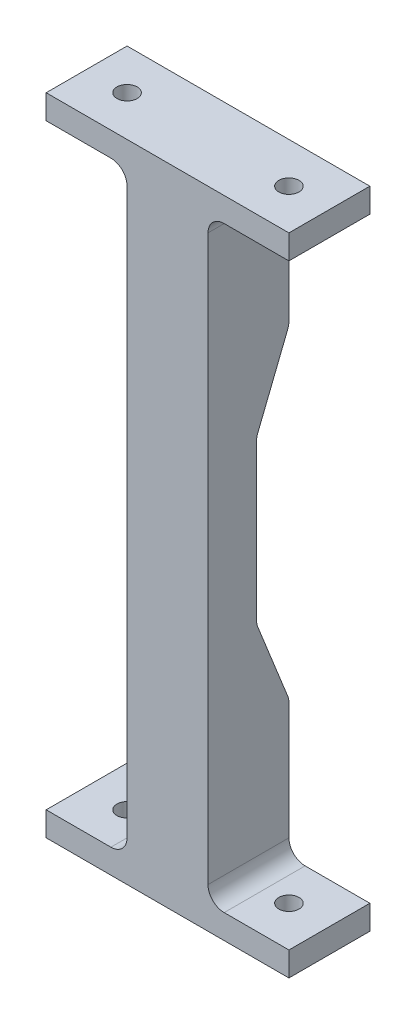
ISO-10303-21;
HEADER;
FILE_DESCRIPTION(('STEP AP214'),'2;1');
FILE_NAME('part.step','',(''),(''),'','','');
FILE_SCHEMA(('AUTOMOTIVE_DESIGN { 1 0 10303 214 1 1 1 1 }'));
ENDSEC;
DATA;
#1=APPLICATION_CONTEXT('core data for automotive mechanical design processes');
#2=APPLICATION_PROTOCOL_DEFINITION('international standard','automotive_design',2000,#1);
#3=PRODUCT_CONTEXT('',#1,'mechanical');
#4=PRODUCT('Part','Part','',(#3));
#5=PRODUCT_RELATED_PRODUCT_CATEGORY('part','',(#4));
#6=PRODUCT_DEFINITION_FORMATION('','',#4);
#7=PRODUCT_DEFINITION_CONTEXT('part definition',#1,'design');
#8=PRODUCT_DEFINITION('design','',#6,#7);
#9=PRODUCT_DEFINITION_SHAPE('','',#8);
#10=(LENGTH_UNIT() NAMED_UNIT(*) SI_UNIT(.MILLI.,.METRE.));
#11=(NAMED_UNIT(*) PLANE_ANGLE_UNIT() SI_UNIT($,.RADIAN.));
#12=(NAMED_UNIT(*) SI_UNIT($,.STERADIAN.) SOLID_ANGLE_UNIT());
#13=UNCERTAINTY_MEASURE_WITH_UNIT(LENGTH_MEASURE(1.E-05),#10,'distance_accuracy_value','');
#14=(GEOMETRIC_REPRESENTATION_CONTEXT(3) GLOBAL_UNCERTAINTY_ASSIGNED_CONTEXT((#13)) GLOBAL_UNIT_ASSIGNED_CONTEXT((#10,
#11,#12)) REPRESENTATION_CONTEXT('',''));
#15=CARTESIAN_POINT('',(0.,0.,0.));
#16=DIRECTION('',(0.,0.,1.));
#17=DIRECTION('',(1.,0.,0.));
#18=AXIS2_PLACEMENT_3D('',#15,#16,#17);
#19=CARTESIAN_POINT('',(0.,0.,-6.35));
#20=DIRECTION('',(0.,0.,-1.));
#21=DIRECTION('',(-1.,0.,0.));
#22=AXIS2_PLACEMENT_3D('',#19,#20,#21);
#23=PLANE('',#22);
#24=DIRECTION('',(0.,1.,0.));
#25=VECTOR('',#24,1.);
#26=CARTESIAN_POINT('',(6.35000000000001,3.81,-6.35));
#27=LINE('',#26,#25);
#28=CARTESIAN_POINT('',(6.34999999999999,76.5240593050608,-6.35));
#29=VERTEX_POINT('',#28);
#30=CARTESIAN_POINT('',(6.34999999999999,94.9198,-6.35));
#31=VERTEX_POINT('',#30);
#32=EDGE_CURVE('E459',#29,#31,#27,.T.);
#33=ORIENTED_EDGE('',*,*,#32,.F.);
#34=DIRECTION('',(1.,0.,0.));
#35=VECTOR('',#34,1.);
#36=CARTESIAN_POINT('',(-6.34999999999999,76.5240593050608,-6.35));
#37=LINE('',#36,#35);
#38=CARTESIAN_POINT('',(-6.34999999999999,76.5240593050608,-6.35));
#39=VERTEX_POINT('',#38);
#40=EDGE_CURVE('E316',#29,#39,#37,.F.);
#41=ORIENTED_EDGE('',*,*,#40,.T.);
#42=DIRECTION('',(0.,-1.,0.));
#43=VECTOR('',#42,1.);
#44=CARTESIAN_POINT('',(-6.34999999999999,3.81,-6.35));
#45=LINE('',#44,#43);
#46=CARTESIAN_POINT('',(-6.34999999999999,94.9198,-6.35));
#47=VERTEX_POINT('',#46);
#48=EDGE_CURVE('E481',#47,#39,#45,.T.);
#49=ORIENTED_EDGE('',*,*,#48,.F.);
#50=CARTESIAN_POINT('',(-8.88999999999999,94.9198,-6.35));
#51=DIRECTION('',(0.,0.,-1.));
#52=DIRECTION('',(-1.,0.,0.));
#53=AXIS2_PLACEMENT_3D('',#50,#51,#52);
#54=CIRCLE('',#53,2.54);
#55=CARTESIAN_POINT('',(-8.88999999999999,97.4598,-6.35));
#56=VERTEX_POINT('',#55);
#57=EDGE_CURVE('E289',#47,#56,#54,.F.);
#58=ORIENTED_EDGE('',*,*,#57,.T.);
#59=DIRECTION('',(1.,0.,0.));
#60=VECTOR('',#59,1.);
#61=CARTESIAN_POINT('',(-6.34999999999999,97.4598,-6.35));
#62=LINE('',#61,#60);
#63=CARTESIAN_POINT('',(-19.05,97.4598,-6.35));
#64=VERTEX_POINT('',#63);
#65=EDGE_CURVE('E476',#64,#56,#62,.T.);
#66=ORIENTED_EDGE('',*,*,#65,.F.);
#67=DIRECTION('',(0.,-1.,0.));
#68=VECTOR('',#67,1.);
#69=CARTESIAN_POINT('',(-19.05,97.4598,-6.35));
#70=LINE('',#69,#68);
#71=CARTESIAN_POINT('',(-19.05,101.2698,-6.35));
#72=VERTEX_POINT('',#71);
#73=EDGE_CURVE('E473',#72,#64,#70,.T.);
#74=ORIENTED_EDGE('',*,*,#73,.F.);
#75=DIRECTION('',(-1.,0.,0.));
#76=VECTOR('',#75,1.);
#77=CARTESIAN_POINT('',(-19.05,101.2698,-6.35));
#78=LINE('',#77,#76);
#79=CARTESIAN_POINT('',(19.05,101.2698,-6.35));
#80=VERTEX_POINT('',#79);
#81=EDGE_CURVE('E470',#80,#72,#78,.T.);
#82=ORIENTED_EDGE('',*,*,#81,.F.);
#83=DIRECTION('',(0.,1.,0.));
#84=VECTOR('',#83,1.);
#85=CARTESIAN_POINT('',(19.05,97.4598,-6.35));
#86=LINE('',#85,#84);
#87=CARTESIAN_POINT('',(19.05,97.4598,-6.35));
#88=VERTEX_POINT('',#87);
#89=EDGE_CURVE('E467',#88,#80,#86,.T.);
#90=ORIENTED_EDGE('',*,*,#89,.F.);
#91=DIRECTION('',(1.,0.,0.));
#92=VECTOR('',#91,1.);
#93=CARTESIAN_POINT('',(6.34999999999999,97.4598,-6.35));
#94=LINE('',#93,#92);
#95=CARTESIAN_POINT('',(8.88999999999999,97.4598,-6.35));
#96=VERTEX_POINT('',#95);
#97=EDGE_CURVE('E464',#96,#88,#94,.T.);
#98=ORIENTED_EDGE('',*,*,#97,.F.);
#99=CARTESIAN_POINT('',(8.88999999999999,94.9198,-6.35));
#100=DIRECTION('',(0.,0.,-1.));
#101=DIRECTION('',(-1.,0.,0.));
#102=AXIS2_PLACEMENT_3D('',#99,#100,#101);
#103=CIRCLE('',#102,2.54);
#104=EDGE_CURVE('E295',#96,#31,#103,.F.);
#105=ORIENTED_EDGE('',*,*,#104,.T.);
#106=EDGE_LOOP('',(#33,#41,#49,#58,#66,#74,#82,#90,#98,#105));
#107=FACE_BOUND('',#106,.T.);
#108=ADVANCED_FACE('F49',(#107),#23,.T.);
#109=CARTESIAN_POINT('',(-19.05,0.,6.35));
#110=DIRECTION('',(1.,0.,0.));
#111=DIRECTION('',(0.,0.,-1.));
#112=AXIS2_PLACEMENT_3D('',#109,#110,#111);
#113=PLANE('',#112);
#114=DIRECTION('',(0.,-1.,0.));
#115=VECTOR('',#114,1.);
#116=CARTESIAN_POINT('',(-19.05,0.,-6.35));
#117=LINE('',#116,#115);
#118=CARTESIAN_POINT('',(-19.05,3.81,-6.35));
#119=VERTEX_POINT('',#118);
#120=CARTESIAN_POINT('',(-19.05,0.,-6.35));
#121=VERTEX_POINT('',#120);
#122=EDGE_CURVE('E234',#119,#121,#117,.T.);
#123=ORIENTED_EDGE('',*,*,#122,.T.);
#124=DIRECTION('',(0.,0.,-1.));
#125=VECTOR('',#124,1.);
#126=CARTESIAN_POINT('',(-19.05,0.,6.35));
#127=LINE('',#126,#125);
#128=CARTESIAN_POINT('',(-19.05,0.,6.35));
#129=VERTEX_POINT('',#128);
#130=EDGE_CURVE('E212',#129,#121,#127,.T.);
#131=ORIENTED_EDGE('',*,*,#130,.F.);
#132=DIRECTION('',(0.,-1.,0.));
#133=VECTOR('',#132,1.);
#134=CARTESIAN_POINT('',(-19.05,0.,6.35));
#135=LINE('',#134,#133);
#136=CARTESIAN_POINT('',(-19.05,3.81,6.35));
#137=VERTEX_POINT('',#136);
#138=EDGE_CURVE('E220',#137,#129,#135,.T.);
#139=ORIENTED_EDGE('',*,*,#138,.F.);
#140=DIRECTION('',(0.,0.,-1.));
#141=VECTOR('',#140,1.);
#142=CARTESIAN_POINT('',(-19.05,3.81,6.35));
#143=LINE('',#142,#141);
#144=EDGE_CURVE('E446',#137,#119,#143,.T.);
#145=ORIENTED_EDGE('',*,*,#144,.T.);
#146=EDGE_LOOP('',(#123,#131,#139,#145));
#147=FACE_BOUND('',#146,.T.);
#148=ADVANCED_FACE('F232',(#147),#113,.F.);
#149=CARTESIAN_POINT('',(19.05,0.,6.35));
#150=DIRECTION('',(0.,1.,0.));
#151=DIRECTION('',(-1.,0.,0.));
#152=AXIS2_PLACEMENT_3D('',#149,#150,#151);
#153=PLANE('',#152);
#154=CARTESIAN_POINT('',(12.7,0.,0.));
#155=DIRECTION('',(0.,1.,0.));
#156=DIRECTION('',(-1.,0.,0.));
#157=AXIS2_PLACEMENT_3D('',#154,#155,#156);
#158=CIRCLE('',#157,1.5875);
#159=CARTESIAN_POINT('',(11.1125,0.,0.));
#160=VERTEX_POINT('',#159);
#161=EDGE_CURVE('E410',#160,#160,#158,.T.);
#162=ORIENTED_EDGE('',*,*,#161,.T.);
#163=EDGE_LOOP('',(#162));
#164=FACE_BOUND('',#163,.T.);
#165=CARTESIAN_POINT('',(-12.7,0.,0.));
#166=DIRECTION('',(0.,1.,0.));
#167=DIRECTION('',(-1.,0.,0.));
#168=AXIS2_PLACEMENT_3D('',#165,#166,#167);
#169=CIRCLE('',#168,1.5875);
#170=CARTESIAN_POINT('',(-14.2875,0.,0.));
#171=VERTEX_POINT('',#170);
#172=EDGE_CURVE('E403',#171,#171,#169,.T.);
#173=ORIENTED_EDGE('',*,*,#172,.T.);
#174=EDGE_LOOP('',(#173));
#175=FACE_BOUND('',#174,.T.);
#176=DIRECTION('',(1.,0.,0.));
#177=VECTOR('',#176,1.);
#178=CARTESIAN_POINT('',(19.05,0.,-6.35));
#179=LINE('',#178,#177);
#180=CARTESIAN_POINT('',(19.05,0.,-6.35));
#181=VERTEX_POINT('',#180);
#182=EDGE_CURVE('E449',#121,#181,#179,.T.);
#183=ORIENTED_EDGE('',*,*,#182,.T.);
#184=DIRECTION('',(0.,0.,-1.));
#185=VECTOR('',#184,1.);
#186=CARTESIAN_POINT('',(19.05,0.,6.35));
#187=LINE('',#186,#185);
#188=CARTESIAN_POINT('',(19.05,0.,6.35));
#189=VERTEX_POINT('',#188);
#190=EDGE_CURVE('E215',#189,#181,#187,.T.);
#191=ORIENTED_EDGE('',*,*,#190,.F.);
#192=DIRECTION('',(1.,0.,0.));
#193=VECTOR('',#192,1.);
#194=CARTESIAN_POINT('',(19.05,0.,6.35));
#195=LINE('',#194,#193);
#196=EDGE_CURVE('E208',#129,#189,#195,.T.);
#197=ORIENTED_EDGE('',*,*,#196,.F.);
#198=ORIENTED_EDGE('',*,*,#130,.T.);
#199=EDGE_LOOP('',(#183,#191,#197,#198));
#200=FACE_BOUND('',#199,.T.);
#201=ADVANCED_FACE('F210',(#164,#175,#200),#153,.F.);
#202=CARTESIAN_POINT('',(19.05,0.,6.35));
#203=DIRECTION('',(-1.,0.,0.));
#204=DIRECTION('',(0.,-1.,0.));
#205=AXIS2_PLACEMENT_3D('',#202,#203,#204);
#206=PLANE('',#205);
#207=DIRECTION('',(0.,1.,0.));
#208=VECTOR('',#207,1.);
#209=CARTESIAN_POINT('',(19.05,0.,-6.35));
#210=LINE('',#209,#208);
#211=CARTESIAN_POINT('',(19.05,3.81,-6.35));
#212=VERTEX_POINT('',#211);
#213=EDGE_CURVE('E452',#181,#212,#210,.T.);
#214=ORIENTED_EDGE('',*,*,#213,.T.);
#215=DIRECTION('',(0.,0.,-1.));
#216=VECTOR('',#215,1.);
#217=CARTESIAN_POINT('',(19.05,3.81,6.35));
#218=LINE('',#217,#216);
#219=CARTESIAN_POINT('',(19.05,3.81,6.35));
#220=VERTEX_POINT('',#219);
#221=EDGE_CURVE('E242',#220,#212,#218,.T.);
#222=ORIENTED_EDGE('',*,*,#221,.F.);
#223=DIRECTION('',(0.,1.,0.));
#224=VECTOR('',#223,1.);
#225=CARTESIAN_POINT('',(19.05,0.,6.35));
#226=LINE('',#225,#224);
#227=EDGE_CURVE('E219',#189,#220,#226,.T.);
#228=ORIENTED_EDGE('',*,*,#227,.F.);
#229=ORIENTED_EDGE('',*,*,#190,.T.);
#230=EDGE_LOOP('',(#214,#222,#228,#229));
#231=FACE_BOUND('',#230,.T.);
#232=ADVANCED_FACE('F568',(#231),#206,.F.);
#233=CARTESIAN_POINT('',(19.05,3.81,6.35));
#234=DIRECTION('',(0.,-1.,0.));
#235=DIRECTION('',(1.,0.,0.));
#236=AXIS2_PLACEMENT_3D('',#233,#234,#235);
#237=PLANE('',#236);
#238=CARTESIAN_POINT('',(12.7,3.81,0.));
#239=DIRECTION('',(0.,1.,0.));
#240=DIRECTION('',(-1.,0.,0.));
#241=AXIS2_PLACEMENT_3D('',#238,#239,#240);
#242=CIRCLE('',#241,1.5875);
#243=CARTESIAN_POINT('',(11.1125,3.81,0.));
#244=VERTEX_POINT('',#243);
#245=EDGE_CURVE('E399',#244,#244,#242,.T.);
#246=ORIENTED_EDGE('',*,*,#245,.F.);
#247=EDGE_LOOP('',(#246));
#248=FACE_BOUND('',#247,.T.);
#249=DIRECTION('',(-1.,0.,0.));
#250=VECTOR('',#249,1.);
#251=CARTESIAN_POINT('',(19.05,3.81,-6.35));
#252=LINE('',#251,#250);
#253=CARTESIAN_POINT('',(8.89000000000002,3.81,-6.35));
#254=VERTEX_POINT('',#253);
#255=EDGE_CURVE('E455',#212,#254,#252,.T.);
#256=ORIENTED_EDGE('',*,*,#255,.T.);
#257=DIRECTION('',(0.,0.,-1.));
#258=VECTOR('',#257,1.);
#259=CARTESIAN_POINT('',(8.89000000000001,3.81,6.35));
#260=LINE('',#259,#258);
#261=CARTESIAN_POINT('',(8.89000000000002,3.81,6.35));
#262=VERTEX_POINT('',#261);
#263=EDGE_CURVE('E255',#254,#262,#260,.F.);
#264=ORIENTED_EDGE('',*,*,#263,.T.);
#265=DIRECTION('',(-1.,0.,0.));
#266=VECTOR('',#265,1.);
#267=CARTESIAN_POINT('',(19.05,3.81,6.35));
#268=LINE('',#267,#266);
#269=EDGE_CURVE('E416',#220,#262,#268,.T.);
#270=ORIENTED_EDGE('',*,*,#269,.F.);
#271=ORIENTED_EDGE('',*,*,#221,.T.);
#272=EDGE_LOOP('',(#256,#264,#270,#271));
#273=FACE_BOUND('',#272,.T.);
#274=ADVANCED_FACE('F509',(#248,#273),#237,.F.);
#275=CARTESIAN_POINT('',(6.35000000000001,3.81,6.35));
#276=DIRECTION('',(-1.,0.,0.));
#277=DIRECTION('',(0.,-1.,0.));
#278=AXIS2_PLACEMENT_3D('',#275,#276,#277);
#279=PLANE('',#278);
#280=DIRECTION('',(0.,0.928476690885259,-0.371390676354104));
#281=VECTOR('',#280,1.);
#282=CARTESIAN_POINT('',(6.35000000000001,9.39274482758623,20.3068620689656));
#283=LINE('',#282,#281);
#284=CARTESIAN_POINT('',(6.35,63.7890730128786,-1.45166920515144));
#285=VERTEX_POINT('',#284);
#286=CARTESIAN_POINT('',(6.34999999999999,75.5807269871214,-6.16833079484856));
#287=VERTEX_POINT('',#286);
#288=EDGE_CURVE('E353',#285,#287,#283,.T.);
#289=ORIENTED_EDGE('',*,*,#288,.T.);
#290=CARTESIAN_POINT('',(6.34999999999999,76.5240593050608,-3.81));
#291=DIRECTION('',(-1.,0.,0.));
#292=DIRECTION('',(0.,-1.,0.));
#293=AXIS2_PLACEMENT_3D('',#290,#291,#292);
#294=CIRCLE('',#293,2.54);
#295=EDGE_CURVE('E313',#287,#29,#294,.F.);
#296=ORIENTED_EDGE('',*,*,#295,.T.);
#297=ORIENTED_EDGE('',*,*,#32,.T.);
#298=DIRECTION('',(0.,0.,-1.));
#299=VECTOR('',#298,1.);
#300=CARTESIAN_POINT('',(6.34999999999999,94.9198,6.35));
#301=LINE('',#300,#299);
#302=CARTESIAN_POINT('',(6.34999999999999,94.9198,6.35));
#303=VERTEX_POINT('',#302);
#304=EDGE_CURVE('E236',#31,#303,#301,.F.);
#305=ORIENTED_EDGE('',*,*,#304,.T.);
#306=DIRECTION('',(0.,1.,0.));
#307=VECTOR('',#306,1.);
#308=CARTESIAN_POINT('',(6.35000000000001,3.81,6.35));
#309=LINE('',#308,#307);
#310=CARTESIAN_POINT('',(6.35000000000001,6.35,6.35));
#311=VERTEX_POINT('',#310);
#312=EDGE_CURVE('E420',#311,#303,#309,.T.);
#313=ORIENTED_EDGE('',*,*,#312,.F.);
#314=DIRECTION('',(0.,0.,-1.));
#315=VECTOR('',#314,1.);
#316=CARTESIAN_POINT('',(6.35000000000001,6.35,-6.35));
#317=LINE('',#316,#315);
#318=CARTESIAN_POINT('',(6.35000000000001,6.35,-6.35));
#319=VERTEX_POINT('',#318);
#320=EDGE_CURVE('E240',#311,#319,#317,.T.);
#321=ORIENTED_EDGE('',*,*,#320,.T.);
#322=CARTESIAN_POINT('',(6.35000000000001,24.7457406949392,-6.35));
#323=VERTEX_POINT('',#322);
#324=EDGE_CURVE('E460',#319,#323,#27,.T.);
#325=ORIENTED_EDGE('',*,*,#324,.T.);
#326=CARTESIAN_POINT('',(6.35000000000001,24.7457406949392,-3.81));
#327=DIRECTION('',(-1.,0.,0.));
#328=DIRECTION('',(0.,-1.,0.));
#329=AXIS2_PLACEMENT_3D('',#326,#327,#328);
#330=CIRCLE('',#329,2.54);
#331=CARTESIAN_POINT('',(6.35000000000001,25.6890730128786,-6.16833079484856));
#332=VERTEX_POINT('',#331);
#333=EDGE_CURVE('E310',#323,#332,#330,.F.);
#334=ORIENTED_EDGE('',*,*,#333,.T.);
#335=DIRECTION('',(0.,0.928476690885259,0.371390676354104));
#336=VECTOR('',#335,1.);
#337=CARTESIAN_POINT('',(6.35000000000001,11.1444689655173,-11.9861724137931));
#338=LINE('',#337,#336);
#339=CARTESIAN_POINT('',(6.35,37.4807269871214,-1.45166920515144));
#340=VERTEX_POINT('',#339);
#341=EDGE_CURVE('E365',#332,#340,#338,.T.);
#342=ORIENTED_EDGE('',*,*,#341,.T.);
#343=CARTESIAN_POINT('',(6.35,38.4240593050608,-3.80999999999999));
#344=DIRECTION('',(-1.,0.,0.));
#345=DIRECTION('',(0.,-1.,0.));
#346=AXIS2_PLACEMENT_3D('',#343,#344,#345);
#347=CIRCLE('',#346,2.54);
#348=CARTESIAN_POINT('',(6.35,38.4240593050608,-1.27));
#349=VERTEX_POINT('',#348);
#350=EDGE_CURVE('E11',#340,#349,#347,.T.);
#351=ORIENTED_EDGE('',*,*,#350,.T.);
#352=DIRECTION('',(0.,1.,0.));
#353=VECTOR('',#352,1.);
#354=CARTESIAN_POINT('',(6.35000000000001,3.81,-1.27));
#355=LINE('',#354,#353);
#356=CARTESIAN_POINT('',(6.35,62.8457406949392,-1.27));
#357=VERTEX_POINT('',#356);
#358=EDGE_CURVE('E355',#349,#357,#355,.T.);
#359=ORIENTED_EDGE('',*,*,#358,.T.);
#360=CARTESIAN_POINT('',(6.35,62.8457406949392,-3.80999999999999));
#361=DIRECTION('',(-1.,0.,0.));
#362=DIRECTION('',(0.,-1.,0.));
#363=AXIS2_PLACEMENT_3D('',#360,#361,#362);
#364=CIRCLE('',#363,2.54);
#365=EDGE_CURVE('E344',#357,#285,#364,.T.);
#366=ORIENTED_EDGE('',*,*,#365,.T.);
#367=EDGE_LOOP('',(#289,#296,#297,#305,#313,#321,#325,#334,#342,#351,#359,#366));
#368=FACE_BOUND('',#367,.T.);
#369=ADVANCED_FACE('F352',(#368),#279,.F.);
#370=CARTESIAN_POINT('',(6.34999999999999,97.4598,6.35));
#371=DIRECTION('',(0.,1.,0.));
#372=DIRECTION('',(0.,0.,1.));
#373=AXIS2_PLACEMENT_3D('',#370,#371,#372);
#374=PLANE('',#373);
#375=CARTESIAN_POINT('',(12.7,97.4598,0.));
#376=DIRECTION('',(0.,1.,0.));
#377=DIRECTION('',(-1.,0.,0.));
#378=AXIS2_PLACEMENT_3D('',#375,#376,#377);
#379=CIRCLE('',#378,1.5875);
#380=CARTESIAN_POINT('',(11.1125,97.4598,0.));
#381=VERTEX_POINT('',#380);
#382=EDGE_CURVE('E389',#381,#381,#379,.T.);
#383=ORIENTED_EDGE('',*,*,#382,.T.);
#384=EDGE_LOOP('',(#383));
#385=FACE_BOUND('',#384,.T.);
#386=DIRECTION('',(1.,0.,0.));
#387=VECTOR('',#386,1.);
#388=CARTESIAN_POINT('',(6.34999999999999,97.4598,6.35));
#389=LINE('',#388,#387);
#390=CARTESIAN_POINT('',(8.88999999999999,97.4598,6.35));
#391=VERTEX_POINT('',#390);
#392=CARTESIAN_POINT('',(19.05,97.4598,6.35));
#393=VERTEX_POINT('',#392);
#394=EDGE_CURVE('E424',#391,#393,#389,.T.);
#395=ORIENTED_EDGE('',*,*,#394,.F.);
#396=DIRECTION('',(0.,0.,-1.));
#397=VECTOR('',#396,1.);
#398=CARTESIAN_POINT('',(8.88999999999999,97.4598,-6.35));
#399=LINE('',#398,#397);
#400=EDGE_CURVE('E272',#391,#96,#399,.T.);
#401=ORIENTED_EDGE('',*,*,#400,.T.);
#402=ORIENTED_EDGE('',*,*,#97,.T.);
#403=DIRECTION('',(0.,0.,-1.));
#404=VECTOR('',#403,1.);
#405=CARTESIAN_POINT('',(19.05,97.4598,6.35));
#406=LINE('',#405,#404);
#407=EDGE_CURVE('E500',#393,#88,#406,.T.);
#408=ORIENTED_EDGE('',*,*,#407,.F.);
#409=EDGE_LOOP('',(#395,#401,#402,#408));
#410=FACE_BOUND('',#409,.T.);
#411=ADVANCED_FACE('F530',(#385,#410),#374,.F.);
#412=CARTESIAN_POINT('',(19.05,97.4598,6.35));
#413=DIRECTION('',(-1.,0.,0.));
#414=DIRECTION('',(0.,0.,1.));
#415=AXIS2_PLACEMENT_3D('',#412,#413,#414);
#416=PLANE('',#415);
#417=ORIENTED_EDGE('',*,*,#89,.T.);
#418=DIRECTION('',(0.,0.,-1.));
#419=VECTOR('',#418,1.);
#420=CARTESIAN_POINT('',(19.05,101.2698,6.35));
#421=LINE('',#420,#419);
#422=CARTESIAN_POINT('',(19.05,101.2698,6.35));
#423=VERTEX_POINT('',#422);
#424=EDGE_CURVE('E496',#423,#80,#421,.T.);
#425=ORIENTED_EDGE('',*,*,#424,.F.);
#426=DIRECTION('',(0.,1.,0.));
#427=VECTOR('',#426,1.);
#428=CARTESIAN_POINT('',(19.05,97.4598,6.35));
#429=LINE('',#428,#427);
#430=EDGE_CURVE('E427',#393,#423,#429,.T.);
#431=ORIENTED_EDGE('',*,*,#430,.F.);
#432=ORIENTED_EDGE('',*,*,#407,.T.);
#433=EDGE_LOOP('',(#417,#425,#431,#432));
#434=FACE_BOUND('',#433,.T.);
#435=ADVANCED_FACE('F539',(#434),#416,.F.);
#436=CARTESIAN_POINT('',(-19.05,101.2698,6.35));
#437=DIRECTION('',(0.,-1.,0.));
#438=DIRECTION('',(0.,0.,-1.));
#439=AXIS2_PLACEMENT_3D('',#436,#437,#438);
#440=PLANE('',#439);
#441=CARTESIAN_POINT('',(12.7,101.2698,0.));
#442=DIRECTION('',(0.,-1.,0.));
#443=DIRECTION('',(0.,0.,-1.));
#444=AXIS2_PLACEMENT_3D('',#441,#442,#443);
#445=CIRCLE('',#444,1.5875);
#446=CARTESIAN_POINT('',(12.7,101.2698,-1.5875));
#447=VERTEX_POINT('',#446);
#448=EDGE_CURVE('E246',#447,#447,#445,.F.);
#449=ORIENTED_EDGE('',*,*,#448,.F.);
#450=EDGE_LOOP('',(#449));
#451=FACE_BOUND('',#450,.T.);
#452=CARTESIAN_POINT('',(-12.7,101.2698,0.));
#453=DIRECTION('',(0.,-1.,0.));
#454=DIRECTION('',(0.,0.,-1.));
#455=AXIS2_PLACEMENT_3D('',#452,#453,#454);
#456=CIRCLE('',#455,1.5875);
#457=CARTESIAN_POINT('',(-12.7,101.2698,-1.5875));
#458=VERTEX_POINT('',#457);
#459=EDGE_CURVE('E250',#458,#458,#456,.F.);
#460=ORIENTED_EDGE('',*,*,#459,.F.);
#461=EDGE_LOOP('',(#460));
#462=FACE_BOUND('',#461,.T.);
#463=ORIENTED_EDGE('',*,*,#81,.T.);
#464=DIRECTION('',(0.,0.,-1.));
#465=VECTOR('',#464,1.);
#466=CARTESIAN_POINT('',(-19.05,101.2698,6.35));
#467=LINE('',#466,#465);
#468=CARTESIAN_POINT('',(-19.05,101.2698,6.35));
#469=VERTEX_POINT('',#468);
#470=EDGE_CURVE('E492',#469,#72,#467,.T.);
#471=ORIENTED_EDGE('',*,*,#470,.F.);
#472=DIRECTION('',(-1.,0.,0.));
#473=VECTOR('',#472,1.);
#474=CARTESIAN_POINT('',(-19.05,101.2698,6.35));
#475=LINE('',#474,#473);
#476=EDGE_CURVE('E430',#423,#469,#475,.T.);
#477=ORIENTED_EDGE('',*,*,#476,.F.);
#478=ORIENTED_EDGE('',*,*,#424,.T.);
#479=EDGE_LOOP('',(#463,#471,#477,#478));
#480=FACE_BOUND('',#479,.T.);
#481=ADVANCED_FACE('F543',(#451,#462,#480),#440,.F.);
#482=CARTESIAN_POINT('',(-19.05,97.4598,6.35));
#483=DIRECTION('',(1.,0.,0.));
#484=DIRECTION('',(0.,0.,-1.));
#485=AXIS2_PLACEMENT_3D('',#482,#483,#484);
#486=PLANE('',#485);
#487=ORIENTED_EDGE('',*,*,#73,.T.);
#488=DIRECTION('',(0.,0.,-1.));
#489=VECTOR('',#488,1.);
#490=CARTESIAN_POINT('',(-19.05,97.4598,6.35));
#491=LINE('',#490,#489);
#492=CARTESIAN_POINT('',(-19.05,97.4598,6.35));
#493=VERTEX_POINT('',#492);
#494=EDGE_CURVE('E488',#493,#64,#491,.T.);
#495=ORIENTED_EDGE('',*,*,#494,.F.);
#496=DIRECTION('',(0.,-1.,0.));
#497=VECTOR('',#496,1.);
#498=CARTESIAN_POINT('',(-19.05,97.4598,6.35));
#499=LINE('',#498,#497);
#500=EDGE_CURVE('E433',#469,#493,#499,.T.);
#501=ORIENTED_EDGE('',*,*,#500,.F.);
#502=ORIENTED_EDGE('',*,*,#470,.T.);
#503=EDGE_LOOP('',(#487,#495,#501,#502));
#504=FACE_BOUND('',#503,.T.);
#505=ADVANCED_FACE('F550',(#504),#486,.F.);
#506=CARTESIAN_POINT('',(-6.34999999999999,97.4598,6.35));
#507=DIRECTION('',(0.,1.,0.));
#508=DIRECTION('',(0.,0.,1.));
#509=AXIS2_PLACEMENT_3D('',#506,#507,#508);
#510=PLANE('',#509);
#511=CARTESIAN_POINT('',(-12.7,97.4598,0.));
#512=DIRECTION('',(0.,1.,0.));
#513=DIRECTION('',(1.,0.,0.));
#514=AXIS2_PLACEMENT_3D('',#511,#512,#513);
#515=CIRCLE('',#514,1.5875);
#516=CARTESIAN_POINT('',(-11.1125,97.4598,0.));
#517=VERTEX_POINT('',#516);
#518=EDGE_CURVE('E388',#517,#517,#515,.T.);
#519=ORIENTED_EDGE('',*,*,#518,.T.);
#520=EDGE_LOOP('',(#519));
#521=FACE_BOUND('',#520,.T.);
#522=ORIENTED_EDGE('',*,*,#65,.T.);
#523=DIRECTION('',(0.,0.,-1.));
#524=VECTOR('',#523,1.);
#525=CARTESIAN_POINT('',(-8.88999999999999,97.4598,6.35));
#526=LINE('',#525,#524);
#527=CARTESIAN_POINT('',(-8.88999999999999,97.4598,6.35));
#528=VERTEX_POINT('',#527);
#529=EDGE_CURVE('E269',#56,#528,#526,.F.);
#530=ORIENTED_EDGE('',*,*,#529,.T.);
#531=DIRECTION('',(1.,0.,0.));
#532=VECTOR('',#531,1.);
#533=CARTESIAN_POINT('',(-6.34999999999999,97.4598,6.35));
#534=LINE('',#533,#532);
#535=EDGE_CURVE('E436',#493,#528,#534,.T.);
#536=ORIENTED_EDGE('',*,*,#535,.F.);
#537=ORIENTED_EDGE('',*,*,#494,.T.);
#538=EDGE_LOOP('',(#522,#530,#536,#537));
#539=FACE_BOUND('',#538,.T.);
#540=ADVANCED_FACE('F553',(#521,#539),#510,.F.);
#541=CARTESIAN_POINT('',(-6.34999999999999,3.81,6.35));
#542=DIRECTION('',(1.,0.,0.));
#543=DIRECTION('',(0.,1.,0.));
#544=AXIS2_PLACEMENT_3D('',#541,#542,#543);
#545=PLANE('',#544);
#546=ORIENTED_EDGE('',*,*,#48,.T.);
#547=CARTESIAN_POINT('',(-6.34999999999998,76.5240593050608,-3.81));
#548=DIRECTION('',(1.,0.,0.));
#549=DIRECTION('',(0.,1.,0.));
#550=AXIS2_PLACEMENT_3D('',#547,#548,#549);
#551=CIRCLE('',#550,2.54);
#552=CARTESIAN_POINT('',(-6.34999999999999,75.5807269871214,-6.16833079484856));
#553=VERTEX_POINT('',#552);
#554=EDGE_CURVE('E321',#39,#553,#551,.F.);
#555=ORIENTED_EDGE('',*,*,#554,.T.);
#556=DIRECTION('',(0.,0.928476690885259,-0.371390676354104));
#557=VECTOR('',#556,1.);
#558=CARTESIAN_POINT('',(-6.34999999999999,76.0349,-6.35));
#559=LINE('',#558,#557);
#560=CARTESIAN_POINT('',(-6.34999999999999,63.7890730128786,-1.45166920515144));
#561=VERTEX_POINT('',#560);
#562=EDGE_CURVE('E372',#561,#553,#559,.T.);
#563=ORIENTED_EDGE('',*,*,#562,.F.);
#564=CARTESIAN_POINT('',(-6.34999999999998,62.8457406949392,-3.80999999999999));
#565=DIRECTION('',(1.,0.,0.));
#566=DIRECTION('',(0.,1.,0.));
#567=AXIS2_PLACEMENT_3D('',#564,#565,#566);
#568=CIRCLE('',#567,2.54);
#569=CARTESIAN_POINT('',(-6.34999999999999,62.8457406949392,-1.27));
#570=VERTEX_POINT('',#569);
#571=EDGE_CURVE('E341',#561,#570,#568,.T.);
#572=ORIENTED_EDGE('',*,*,#571,.T.);
#573=DIRECTION('',(0.,1.,0.));
#574=VECTOR('',#573,1.);
#575=CARTESIAN_POINT('',(-6.34999999999999,63.3349,-1.27));
#576=LINE('',#575,#574);
#577=CARTESIAN_POINT('',(-6.34999999999999,38.4240593050608,-1.27));
#578=VERTEX_POINT('',#577);
#579=EDGE_CURVE('E371',#578,#570,#576,.T.);
#580=ORIENTED_EDGE('',*,*,#579,.F.);
#581=CARTESIAN_POINT('',(-6.34999999999998,38.4240593050608,-3.80999999999999));
#582=DIRECTION('',(1.,0.,0.));
#583=DIRECTION('',(0.,1.,0.));
#584=AXIS2_PLACEMENT_3D('',#581,#582,#583);
#585=CIRCLE('',#584,2.54);
#586=CARTESIAN_POINT('',(-6.34999999999999,37.4807269871214,-1.45166920515143));
#587=VERTEX_POINT('',#586);
#588=EDGE_CURVE('E58',#578,#587,#585,.T.);
#589=ORIENTED_EDGE('',*,*,#588,.T.);
#590=DIRECTION('',(0.,0.928476690885259,0.371390676354104));
#591=VECTOR('',#590,1.);
#592=CARTESIAN_POINT('',(-6.34999999999999,25.2349,-6.35));
#593=LINE('',#592,#591);
#594=CARTESIAN_POINT('',(-6.34999999999999,25.6890730128786,-6.16833079484856));
#595=VERTEX_POINT('',#594);
#596=EDGE_CURVE('E377',#595,#587,#593,.T.);
#597=ORIENTED_EDGE('',*,*,#596,.F.);
#598=CARTESIAN_POINT('',(-6.34999999999998,24.7457406949392,-3.81));
#599=DIRECTION('',(1.,0.,0.));
#600=DIRECTION('',(0.,1.,0.));
#601=AXIS2_PLACEMENT_3D('',#598,#599,#600);
#602=CIRCLE('',#601,2.54);
#603=CARTESIAN_POINT('',(-6.34999999999999,24.7457406949392,-6.35));
#604=VERTEX_POINT('',#603);
#605=EDGE_CURVE('E65',#595,#604,#602,.F.);
#606=ORIENTED_EDGE('',*,*,#605,.T.);
#607=CARTESIAN_POINT('',(-6.34999999999999,6.35,-6.35));
#608=VERTEX_POINT('',#607);
#609=EDGE_CURVE('E480',#604,#608,#45,.T.);
#610=ORIENTED_EDGE('',*,*,#609,.T.);
#611=DIRECTION('',(0.,0.,-1.));
#612=VECTOR('',#611,1.);
#613=CARTESIAN_POINT('',(-6.34999999999999,6.35,6.35));
#614=LINE('',#613,#612);
#615=CARTESIAN_POINT('',(-6.34999999999999,6.35,6.35));
#616=VERTEX_POINT('',#615);
#617=EDGE_CURVE('E266',#608,#616,#614,.F.);
#618=ORIENTED_EDGE('',*,*,#617,.T.);
#619=DIRECTION('',(0.,-1.,0.));
#620=VECTOR('',#619,1.);
#621=CARTESIAN_POINT('',(-6.34999999999999,3.81,6.35));
#622=LINE('',#621,#620);
#623=CARTESIAN_POINT('',(-6.34999999999999,94.9198,6.35));
#624=VERTEX_POINT('',#623);
#625=EDGE_CURVE('E440',#624,#616,#622,.T.);
#626=ORIENTED_EDGE('',*,*,#625,.F.);
#627=DIRECTION('',(0.,0.,-1.));
#628=VECTOR('',#627,1.);
#629=CARTESIAN_POINT('',(-6.34999999999999,94.9198,-6.35));
#630=LINE('',#629,#628);
#631=EDGE_CURVE('E262',#624,#47,#630,.T.);
#632=ORIENTED_EDGE('',*,*,#631,.T.);
#633=EDGE_LOOP('',(#546,#555,#563,#572,#580,#589,#597,#606,#610,#618,#626,#632));
#634=FACE_BOUND('',#633,.T.);
#635=ADVANCED_FACE('F370',(#634),#545,.F.);
#636=CARTESIAN_POINT('',(-19.05,3.81,6.35));
#637=DIRECTION('',(0.,-1.,0.));
#638=DIRECTION('',(0.,0.,-1.));
#639=AXIS2_PLACEMENT_3D('',#636,#637,#638);
#640=PLANE('',#639);
#641=CARTESIAN_POINT('',(-12.7,3.80999999999999,0.));
#642=DIRECTION('',(0.,1.,0.));
#643=DIRECTION('',(1.,0.,0.));
#644=AXIS2_PLACEMENT_3D('',#641,#642,#643);
#645=CIRCLE('',#644,1.5875);
#646=CARTESIAN_POINT('',(-11.1125,3.80999999999999,0.));
#647=VERTEX_POINT('',#646);
#648=EDGE_CURVE('E249',#647,#647,#645,.T.);
#649=ORIENTED_EDGE('',*,*,#648,.F.);
#650=EDGE_LOOP('',(#649));
#651=FACE_BOUND('',#650,.T.);
#652=DIRECTION('',(-1.,0.,0.));
#653=VECTOR('',#652,1.);
#654=CARTESIAN_POINT('',(-19.05,3.81,6.35));
#655=LINE('',#654,#653);
#656=CARTESIAN_POINT('',(-8.88999999999999,3.81,6.35));
#657=VERTEX_POINT('',#656);
#658=EDGE_CURVE('E225',#657,#137,#655,.T.);
#659=ORIENTED_EDGE('',*,*,#658,.F.);
#660=DIRECTION('',(0.,0.,-1.));
#661=VECTOR('',#660,1.);
#662=CARTESIAN_POINT('',(-8.88999999999999,3.81,-6.35));
#663=LINE('',#662,#661);
#664=CARTESIAN_POINT('',(-8.88999999999999,3.81,-6.35));
#665=VERTEX_POINT('',#664);
#666=EDGE_CURVE('E258',#657,#665,#663,.T.);
#667=ORIENTED_EDGE('',*,*,#666,.T.);
#668=DIRECTION('',(-1.,0.,0.));
#669=VECTOR('',#668,1.);
#670=CARTESIAN_POINT('',(-19.05,3.81,-6.35));
#671=LINE('',#670,#669);
#672=EDGE_CURVE('E230',#665,#119,#671,.T.);
#673=ORIENTED_EDGE('',*,*,#672,.T.);
#674=ORIENTED_EDGE('',*,*,#144,.F.);
#675=EDGE_LOOP('',(#659,#667,#673,#674));
#676=FACE_BOUND('',#675,.T.);
#677=ADVANCED_FACE('F566',(#651,#676),#640,.F.);
#678=CARTESIAN_POINT('',(0.,0.,6.35));
#679=DIRECTION('',(0.,0.,-1.));
#680=DIRECTION('',(-1.,0.,0.));
#681=AXIS2_PLACEMENT_3D('',#678,#679,#680);
#682=PLANE('',#681);
#683=ORIENTED_EDGE('',*,*,#138,.T.);
#684=ORIENTED_EDGE('',*,*,#196,.T.);
#685=ORIENTED_EDGE('',*,*,#227,.T.);
#686=ORIENTED_EDGE('',*,*,#269,.T.);
#687=CARTESIAN_POINT('',(8.89000000000001,6.35,6.35));
#688=DIRECTION('',(0.,0.,-1.));
#689=DIRECTION('',(-1.,0.,0.));
#690=AXIS2_PLACEMENT_3D('',#687,#688,#689);
#691=CIRCLE('',#690,2.54);
#692=EDGE_CURVE('E279',#262,#311,#691,.T.);
#693=ORIENTED_EDGE('',*,*,#692,.T.);
#694=ORIENTED_EDGE('',*,*,#312,.T.);
#695=CARTESIAN_POINT('',(8.88999999999999,94.9198,6.35));
#696=DIRECTION('',(0.,0.,-1.));
#697=DIRECTION('',(-1.,0.,0.));
#698=AXIS2_PLACEMENT_3D('',#695,#696,#697);
#699=CIRCLE('',#698,2.54);
#700=EDGE_CURVE('E299',#303,#391,#699,.T.);
#701=ORIENTED_EDGE('',*,*,#700,.T.);
#702=ORIENTED_EDGE('',*,*,#394,.T.);
#703=ORIENTED_EDGE('',*,*,#430,.T.);
#704=ORIENTED_EDGE('',*,*,#476,.T.);
#705=ORIENTED_EDGE('',*,*,#500,.T.);
#706=ORIENTED_EDGE('',*,*,#535,.T.);
#707=CARTESIAN_POINT('',(-8.88999999999999,94.9198,6.35));
#708=DIRECTION('',(0.,0.,-1.));
#709=DIRECTION('',(-1.,0.,0.));
#710=AXIS2_PLACEMENT_3D('',#707,#708,#709);
#711=CIRCLE('',#710,2.54);
#712=EDGE_CURVE('E292',#528,#624,#711,.T.);
#713=ORIENTED_EDGE('',*,*,#712,.T.);
#714=ORIENTED_EDGE('',*,*,#625,.T.);
#715=CARTESIAN_POINT('',(-8.88999999999999,6.35,6.35));
#716=DIRECTION('',(0.,0.,-1.));
#717=DIRECTION('',(-1.,0.,0.));
#718=AXIS2_PLACEMENT_3D('',#715,#716,#717);
#719=CIRCLE('',#718,2.54);
#720=EDGE_CURVE('E286',#616,#657,#719,.T.);
#721=ORIENTED_EDGE('',*,*,#720,.T.);
#722=ORIENTED_EDGE('',*,*,#658,.T.);
#723=EDGE_LOOP('',(#683,#684,#685,#686,#693,#694,#701,#702,#703,#704,#705,#706,#713,#714,#721,#722));
#724=FACE_BOUND('',#723,.T.);
#725=ADVANCED_FACE('F223',(#724),#682,.F.);
#726=ORIENTED_EDGE('',*,*,#609,.F.);
#727=DIRECTION('',(-1.,0.,0.));
#728=VECTOR('',#727,1.);
#729=CARTESIAN_POINT('',(6.35000000000001,24.7457406949392,-6.35));
#730=LINE('',#729,#728);
#731=EDGE_CURVE('E338',#604,#323,#730,.F.);
#732=ORIENTED_EDGE('',*,*,#731,.T.);
#733=ORIENTED_EDGE('',*,*,#324,.F.);
#734=CARTESIAN_POINT('',(8.89000000000001,6.35,-6.35));
#735=DIRECTION('',(0.,0.,-1.));
#736=DIRECTION('',(-1.,0.,0.));
#737=AXIS2_PLACEMENT_3D('',#734,#735,#736);
#738=CIRCLE('',#737,2.54);
#739=EDGE_CURVE('E276',#319,#254,#738,.F.);
#740=ORIENTED_EDGE('',*,*,#739,.T.);
#741=ORIENTED_EDGE('',*,*,#255,.F.);
#742=ORIENTED_EDGE('',*,*,#213,.F.);
#743=ORIENTED_EDGE('',*,*,#182,.F.);
#744=ORIENTED_EDGE('',*,*,#122,.F.);
#745=ORIENTED_EDGE('',*,*,#672,.F.);
#746=CARTESIAN_POINT('',(-8.88999999999999,6.35,-6.35));
#747=DIRECTION('',(0.,0.,-1.));
#748=DIRECTION('',(-1.,0.,0.));
#749=AXIS2_PLACEMENT_3D('',#746,#747,#748);
#750=CIRCLE('',#749,2.54);
#751=EDGE_CURVE('E282',#665,#608,#750,.F.);
#752=ORIENTED_EDGE('',*,*,#751,.T.);
#753=EDGE_LOOP('',(#726,#732,#733,#740,#741,#742,#743,#744,#745,#752));
#754=FACE_BOUND('',#753,.T.);
#755=ADVANCED_FACE('F514',(#754),#23,.T.);
#756=CARTESIAN_POINT('',(-12.7,-8.89000000000001,0.));
#757=DIRECTION('',(0.,1.,0.));
#758=DIRECTION('',(-1.,0.,0.));
#759=AXIS2_PLACEMENT_3D('',#756,#757,#758);
#760=CYLINDRICAL_SURFACE('',#759,1.5875);
#761=ORIENTED_EDGE('',*,*,#648,.T.);
#762=EDGE_LOOP('',(#761));
#763=FACE_BOUND('',#762,.T.);
#764=ORIENTED_EDGE('',*,*,#172,.F.);
#765=EDGE_LOOP('',(#764));
#766=FACE_BOUND('',#765,.T.);
#767=ADVANCED_FACE('F591',(#763,#766),#760,.F.);
#768=CARTESIAN_POINT('',(12.7,-8.89,0.));
#769=DIRECTION('',(0.,1.,0.));
#770=DIRECTION('',(-1.,0.,0.));
#771=AXIS2_PLACEMENT_3D('',#768,#769,#770);
#772=CYLINDRICAL_SURFACE('',#771,1.5875);
#773=ORIENTED_EDGE('',*,*,#245,.T.);
#774=EDGE_LOOP('',(#773));
#775=FACE_BOUND('',#774,.T.);
#776=ORIENTED_EDGE('',*,*,#161,.F.);
#777=EDGE_LOOP('',(#776));
#778=FACE_BOUND('',#777,.T.);
#779=ADVANCED_FACE('F597',(#775,#778),#772,.F.);
#780=CARTESIAN_POINT('',(-12.7,110.1598,0.));
#781=DIRECTION('',(0.,-1.,0.));
#782=DIRECTION('',(1.,0.,0.));
#783=AXIS2_PLACEMENT_3D('',#780,#781,#782);
#784=CYLINDRICAL_SURFACE('',#783,1.5875);
#785=ORIENTED_EDGE('',*,*,#518,.F.);
#786=EDGE_LOOP('',(#785));
#787=FACE_BOUND('',#786,.T.);
#788=ORIENTED_EDGE('',*,*,#459,.T.);
#789=EDGE_LOOP('',(#788));
#790=FACE_BOUND('',#789,.T.);
#791=ADVANCED_FACE('F609',(#787,#790),#784,.F.);
#792=CARTESIAN_POINT('',(12.7,110.1598,0.));
#793=DIRECTION('',(0.,-1.,0.));
#794=DIRECTION('',(1.,0.,0.));
#795=AXIS2_PLACEMENT_3D('',#792,#793,#794);
#796=CYLINDRICAL_SURFACE('',#795,1.5875);
#797=ORIENTED_EDGE('',*,*,#382,.F.);
#798=EDGE_LOOP('',(#797));
#799=FACE_BOUND('',#798,.T.);
#800=ORIENTED_EDGE('',*,*,#448,.T.);
#801=EDGE_LOOP('',(#800));
#802=FACE_BOUND('',#801,.T.);
#803=ADVANCED_FACE('F613',(#799,#802),#796,.F.);
#804=CARTESIAN_POINT('',(8.89000000000001,6.35,6.35));
#805=DIRECTION('',(0.,0.,1.));
#806=DIRECTION('',(1.,0.,0.));
#807=AXIS2_PLACEMENT_3D('',#804,#805,#806);
#808=CYLINDRICAL_SURFACE('',#807,2.54);
#809=ORIENTED_EDGE('',*,*,#692,.F.);
#810=ORIENTED_EDGE('',*,*,#263,.F.);
#811=ORIENTED_EDGE('',*,*,#739,.F.);
#812=ORIENTED_EDGE('',*,*,#320,.F.);
#813=EDGE_LOOP('',(#809,#810,#811,#812));
#814=FACE_BOUND('',#813,.T.);
#815=ADVANCED_FACE('F519',(#814),#808,.F.);
#816=CARTESIAN_POINT('',(-8.88999999999999,6.35,6.35));
#817=DIRECTION('',(0.,0.,1.));
#818=DIRECTION('',(1.,0.,0.));
#819=AXIS2_PLACEMENT_3D('',#816,#817,#818);
#820=CYLINDRICAL_SURFACE('',#819,2.54);
#821=ORIENTED_EDGE('',*,*,#720,.F.);
#822=ORIENTED_EDGE('',*,*,#617,.F.);
#823=ORIENTED_EDGE('',*,*,#751,.F.);
#824=ORIENTED_EDGE('',*,*,#666,.F.);
#825=EDGE_LOOP('',(#821,#822,#823,#824));
#826=FACE_BOUND('',#825,.T.);
#827=ADVANCED_FACE('F563',(#826),#820,.F.);
#828=CARTESIAN_POINT('',(-8.88999999999999,94.9198,6.35));
#829=DIRECTION('',(0.,0.,1.));
#830=DIRECTION('',(1.,0.,0.));
#831=AXIS2_PLACEMENT_3D('',#828,#829,#830);
#832=CYLINDRICAL_SURFACE('',#831,2.54);
#833=ORIENTED_EDGE('',*,*,#712,.F.);
#834=ORIENTED_EDGE('',*,*,#529,.F.);
#835=ORIENTED_EDGE('',*,*,#57,.F.);
#836=ORIENTED_EDGE('',*,*,#631,.F.);
#837=EDGE_LOOP('',(#833,#834,#835,#836));
#838=FACE_BOUND('',#837,.T.);
#839=ADVANCED_FACE('F556',(#838),#832,.F.);
#840=CARTESIAN_POINT('',(8.88999999999999,94.9198,6.35));
#841=DIRECTION('',(0.,0.,1.));
#842=DIRECTION('',(1.,0.,0.));
#843=AXIS2_PLACEMENT_3D('',#840,#841,#842);
#844=CYLINDRICAL_SURFACE('',#843,2.54);
#845=ORIENTED_EDGE('',*,*,#700,.F.);
#846=ORIENTED_EDGE('',*,*,#304,.F.);
#847=ORIENTED_EDGE('',*,*,#104,.F.);
#848=ORIENTED_EDGE('',*,*,#400,.F.);
#849=EDGE_LOOP('',(#845,#846,#847,#848));
#850=FACE_BOUND('',#849,.T.);
#851=ADVANCED_FACE('F527',(#850),#844,.F.);
#852=CARTESIAN_POINT('',(19.05,63.3349,-1.27));
#853=DIRECTION('',(0.,0.,1.));
#854=DIRECTION('',(1.,0.,0.));
#855=AXIS2_PLACEMENT_3D('',#852,#853,#854);
#856=PLANE('',#855);
#857=ORIENTED_EDGE('',*,*,#579,.T.);
#858=DIRECTION('',(-1.,0.,0.));
#859=VECTOR('',#858,1.);
#860=CARTESIAN_POINT('',(6.35000000000001,62.8457406949392,-1.27));
#861=LINE('',#860,#859);
#862=EDGE_CURVE('E328',#570,#357,#861,.F.);
#863=ORIENTED_EDGE('',*,*,#862,.T.);
#864=ORIENTED_EDGE('',*,*,#358,.F.);
#865=DIRECTION('',(-1.,0.,0.));
#866=VECTOR('',#865,1.);
#867=CARTESIAN_POINT('',(-6.34999999999998,38.4240593050608,-1.27));
#868=LINE('',#867,#866);
#869=EDGE_CURVE('E324',#349,#578,#868,.T.);
#870=ORIENTED_EDGE('',*,*,#869,.T.);
#871=EDGE_LOOP('',(#857,#863,#864,#870));
#872=FACE_BOUND('',#871,.T.);
#873=ADVANCED_FACE('F374',(#872),#856,.F.);
#874=CARTESIAN_POINT('',(19.05,76.0349,-6.35));
#875=DIRECTION('',(0.,0.371390676354104,0.928476690885259));
#876=DIRECTION('',(0.,-0.928476690885259,0.371390676354104));
#877=AXIS2_PLACEMENT_3D('',#874,#875,#876);
#878=PLANE('',#877);
#879=ORIENTED_EDGE('',*,*,#562,.T.);
#880=DIRECTION('',(1.,0.,0.));
#881=VECTOR('',#880,1.);
#882=CARTESIAN_POINT('',(6.35,75.5807269871214,-6.16833079484856));
#883=LINE('',#882,#881);
#884=EDGE_CURVE('E306',#553,#287,#883,.T.);
#885=ORIENTED_EDGE('',*,*,#884,.T.);
#886=ORIENTED_EDGE('',*,*,#288,.F.);
#887=DIRECTION('',(-1.,0.,0.));
#888=VECTOR('',#887,1.);
#889=CARTESIAN_POINT('',(-6.34999999999998,63.7890730128786,-1.45166920515144));
#890=LINE('',#889,#888);
#891=EDGE_CURVE('E302',#285,#561,#890,.T.);
#892=ORIENTED_EDGE('',*,*,#891,.T.);
#893=EDGE_LOOP('',(#879,#885,#886,#892));
#894=FACE_BOUND('',#893,.T.);
#895=ADVANCED_FACE('F361',(#894),#878,.F.);
#896=CARTESIAN_POINT('',(19.05,25.2349,-6.35));
#897=DIRECTION('',(0.,-0.371390676354104,0.928476690885259));
#898=DIRECTION('',(0.,-0.928476690885259,-0.371390676354104));
#899=AXIS2_PLACEMENT_3D('',#896,#897,#898);
#900=PLANE('',#899);
#901=ORIENTED_EDGE('',*,*,#596,.T.);
#902=DIRECTION('',(-1.,0.,0.));
#903=VECTOR('',#902,1.);
#904=CARTESIAN_POINT('',(6.35000000000001,37.4807269871214,-1.45166920515143));
#905=LINE('',#904,#903);
#906=EDGE_CURVE('E335',#587,#340,#905,.F.);
#907=ORIENTED_EDGE('',*,*,#906,.T.);
#908=ORIENTED_EDGE('',*,*,#341,.F.);
#909=DIRECTION('',(-1.,0.,0.));
#910=VECTOR('',#909,1.);
#911=CARTESIAN_POINT('',(-6.34999999999999,25.6890730128786,-6.16833079484856));
#912=LINE('',#911,#910);
#913=EDGE_CURVE('E331',#332,#595,#912,.T.);
#914=ORIENTED_EDGE('',*,*,#913,.T.);
#915=EDGE_LOOP('',(#901,#907,#908,#914));
#916=FACE_BOUND('',#915,.T.);
#917=ADVANCED_FACE('F620',(#916),#900,.F.);
#918=CARTESIAN_POINT('',(19.05,76.5240593050608,-3.81));
#919=DIRECTION('',(-1.,0.,0.));
#920=DIRECTION('',(0.,-1.,0.));
#921=AXIS2_PLACEMENT_3D('',#918,#919,#920);
#922=CYLINDRICAL_SURFACE('',#921,2.54);
#923=ORIENTED_EDGE('',*,*,#554,.F.);
#924=ORIENTED_EDGE('',*,*,#40,.F.);
#925=ORIENTED_EDGE('',*,*,#295,.F.);
#926=ORIENTED_EDGE('',*,*,#884,.F.);
#927=EDGE_LOOP('',(#923,#924,#925,#926));
#928=FACE_BOUND('',#927,.T.);
#929=ADVANCED_FACE('F623',(#928),#922,.T.);
#930=CARTESIAN_POINT('',(19.05,62.8457406949392,-3.80999999999999));
#931=DIRECTION('',(1.,0.,0.));
#932=DIRECTION('',(0.,1.,0.));
#933=AXIS2_PLACEMENT_3D('',#930,#931,#932);
#934=CYLINDRICAL_SURFACE('',#933,2.54);
#935=ORIENTED_EDGE('',*,*,#365,.F.);
#936=ORIENTED_EDGE('',*,*,#862,.F.);
#937=ORIENTED_EDGE('',*,*,#571,.F.);
#938=ORIENTED_EDGE('',*,*,#891,.F.);
#939=EDGE_LOOP('',(#935,#936,#937,#938));
#940=FACE_BOUND('',#939,.T.);
#941=ADVANCED_FACE('F367',(#940),#934,.F.);
#942=CARTESIAN_POINT('',(19.05,38.4240593050608,-3.80999999999999));
#943=DIRECTION('',(1.,0.,0.));
#944=DIRECTION('',(0.,1.,0.));
#945=AXIS2_PLACEMENT_3D('',#942,#943,#944);
#946=CYLINDRICAL_SURFACE('',#945,2.54);
#947=ORIENTED_EDGE('',*,*,#350,.F.);
#948=ORIENTED_EDGE('',*,*,#906,.F.);
#949=ORIENTED_EDGE('',*,*,#588,.F.);
#950=ORIENTED_EDGE('',*,*,#869,.F.);
#951=EDGE_LOOP('',(#947,#948,#949,#950));
#952=FACE_BOUND('',#951,.T.);
#953=ADVANCED_FACE('F638',(#952),#946,.F.);
#954=CARTESIAN_POINT('',(19.05,24.7457406949392,-3.81));
#955=DIRECTION('',(1.,0.,0.));
#956=DIRECTION('',(0.,1.,0.));
#957=AXIS2_PLACEMENT_3D('',#954,#955,#956);
#958=CYLINDRICAL_SURFACE('',#957,2.54);
#959=ORIENTED_EDGE('',*,*,#333,.F.);
#960=ORIENTED_EDGE('',*,*,#731,.F.);
#961=ORIENTED_EDGE('',*,*,#605,.F.);
#962=ORIENTED_EDGE('',*,*,#913,.F.);
#963=EDGE_LOOP('',(#959,#960,#961,#962));
#964=FACE_BOUND('',#963,.T.);
#965=ADVANCED_FACE('F51',(#964),#958,.T.);
#966=CLOSED_SHELL('',(#108,#148,#201,#232,#274,#369,#411,#435,#481,#505,#540,#635,#677,#725,
#755,#767,#779,#791,#803,#815,#827,#839,#851,#873,#895,#917,#929,#941,#953,#965));
#967=MANIFOLD_SOLID_BREP('B2',#966);
#968=ADVANCED_BREP_SHAPE_REPRESENTATION('',(#18,#967),#14);
#969=SHAPE_DEFINITION_REPRESENTATION(#9,#968);
ENDSEC;
END-ISO-10303-21;
